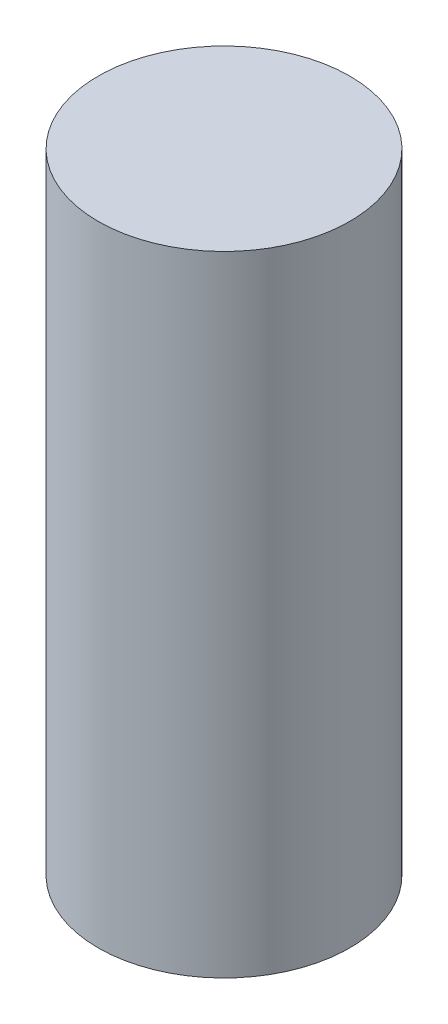
ISO-10303-21;
HEADER;
FILE_DESCRIPTION(('STEP AP214'),'2;1');
FILE_NAME('part.step','',(''),(''),'','','');
FILE_SCHEMA(('AUTOMOTIVE_DESIGN { 1 0 10303 214 1 1 1 1 }'));
ENDSEC;
DATA;
#1=APPLICATION_CONTEXT('core data for automotive mechanical design processes');
#2=APPLICATION_PROTOCOL_DEFINITION('international standard','automotive_design',2000,#1);
#3=PRODUCT_CONTEXT('',#1,'mechanical');
#4=PRODUCT('Part','Part','',(#3));
#5=PRODUCT_RELATED_PRODUCT_CATEGORY('part','',(#4));
#6=PRODUCT_DEFINITION_FORMATION('','',#4);
#7=PRODUCT_DEFINITION_CONTEXT('part definition',#1,'design');
#8=PRODUCT_DEFINITION('design','',#6,#7);
#9=PRODUCT_DEFINITION_SHAPE('','',#8);
#10=(LENGTH_UNIT() NAMED_UNIT(*) SI_UNIT(.MILLI.,.METRE.));
#11=(NAMED_UNIT(*) PLANE_ANGLE_UNIT() SI_UNIT($,.RADIAN.));
#12=(NAMED_UNIT(*) SI_UNIT($,.STERADIAN.) SOLID_ANGLE_UNIT());
#13=UNCERTAINTY_MEASURE_WITH_UNIT(LENGTH_MEASURE(1.E-05),#10,'distance_accuracy_value','');
#14=(GEOMETRIC_REPRESENTATION_CONTEXT(3) GLOBAL_UNCERTAINTY_ASSIGNED_CONTEXT((#13)) GLOBAL_UNIT_ASSIGNED_CONTEXT((#10,
#11,#12)) REPRESENTATION_CONTEXT('',''));
#15=CARTESIAN_POINT('',(0.,0.,0.));
#16=DIRECTION('',(0.,0.,1.));
#17=DIRECTION('',(1.,0.,0.));
#18=AXIS2_PLACEMENT_3D('',#15,#16,#17);
#19=CARTESIAN_POINT('',(-2.30841713962909,40.,-1.64694088324415));
#20=DIRECTION('',(0.,-1.,0.));
#21=DIRECTION('',(0.,0.,-1.));
#22=AXIS2_PLACEMENT_3D('',#19,#20,#21);
#23=CYLINDRICAL_SURFACE('',#22,8.);
#24=CARTESIAN_POINT('',(-2.30841713962909,40.,-1.64694088324415));
#25=DIRECTION('',(0.,1.,0.));
#26=DIRECTION('',(0.,0.,1.));
#27=AXIS2_PLACEMENT_3D('',#24,#25,#26);
#28=CIRCLE('',#27,8.);
#29=CARTESIAN_POINT('',(-2.30841713962909,40.,6.35305911675585));
#30=VERTEX_POINT('',#29);
#31=EDGE_CURVE('E10',#30,#30,#28,.T.);
#32=ORIENTED_EDGE('',*,*,#31,.F.);
#33=EDGE_LOOP('',(#32));
#34=FACE_BOUND('',#33,.T.);
#35=CARTESIAN_POINT('',(-2.30841713962909,0.,-1.64694088324415));
#36=DIRECTION('',(0.,1.,0.));
#37=DIRECTION('',(0.,0.,1.));
#38=AXIS2_PLACEMENT_3D('',#35,#36,#37);
#39=CIRCLE('',#38,8.);
#40=CARTESIAN_POINT('',(-2.30841713962909,0.,6.35305911675585));
#41=VERTEX_POINT('',#40);
#42=EDGE_CURVE('E40',#41,#41,#39,.T.);
#43=ORIENTED_EDGE('',*,*,#42,.T.);
#44=EDGE_LOOP('',(#43));
#45=FACE_BOUND('',#44,.T.);
#46=ADVANCED_FACE('F37',(#34,#45),#23,.T.);
#47=CARTESIAN_POINT('',(-2.30841713962909,40.,-1.64694088324415));
#48=DIRECTION('',(0.,1.,0.));
#49=DIRECTION('',(0.,0.,1.));
#50=AXIS2_PLACEMENT_3D('',#47,#48,#49);
#51=PLANE('',#50);
#52=ORIENTED_EDGE('',*,*,#31,.T.);
#53=EDGE_LOOP('',(#52));
#54=FACE_BOUND('',#53,.T.);
#55=ADVANCED_FACE('F52',(#54),#51,.T.);
#56=CARTESIAN_POINT('',(-2.30841713962909,0.,-1.64694088324415));
#57=DIRECTION('',(0.,1.,0.));
#58=DIRECTION('',(0.,0.,1.));
#59=AXIS2_PLACEMENT_3D('',#56,#57,#58);
#60=PLANE('',#59);
#61=ORIENTED_EDGE('',*,*,#42,.F.);
#62=EDGE_LOOP('',(#61));
#63=FACE_BOUND('',#62,.T.);
#64=ADVANCED_FACE('F50',(#63),#60,.F.);
#65=CLOSED_SHELL('',(#46,#55,#64));
#66=MANIFOLD_SOLID_BREP('B2',#65);
#67=ADVANCED_BREP_SHAPE_REPRESENTATION('',(#18,#66),#14);
#68=SHAPE_DEFINITION_REPRESENTATION(#9,#67);
ENDSEC;
END-ISO-10303-21;
